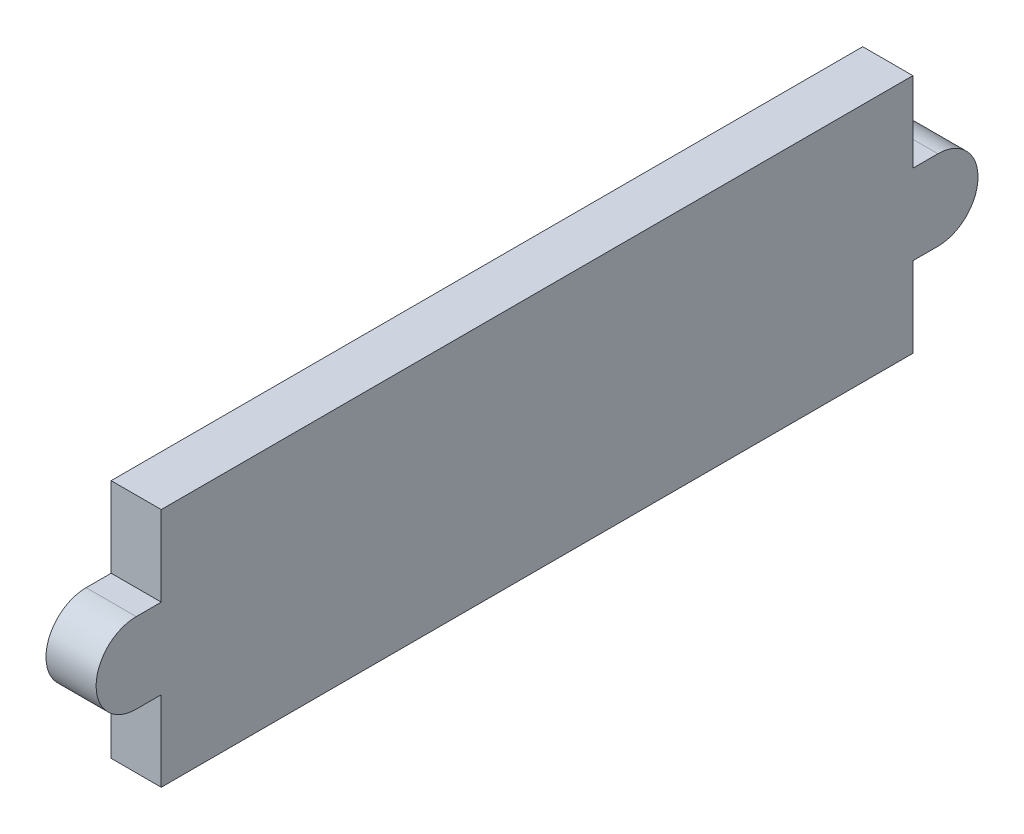
ISO-10303-21;
HEADER;
FILE_DESCRIPTION(('STEP AP214'),'2;1');
FILE_NAME('part.step','',(''),(''),'','','');
FILE_SCHEMA(('AUTOMOTIVE_DESIGN { 1 0 10303 214 1 1 1 1 }'));
ENDSEC;
DATA;
#1=APPLICATION_CONTEXT('core data for automotive mechanical design processes');
#2=APPLICATION_PROTOCOL_DEFINITION('international standard','automotive_design',2000,#1);
#3=PRODUCT_CONTEXT('',#1,'mechanical');
#4=PRODUCT('Part','Part','',(#3));
#5=PRODUCT_RELATED_PRODUCT_CATEGORY('part','',(#4));
#6=PRODUCT_DEFINITION_FORMATION('','',#4);
#7=PRODUCT_DEFINITION_CONTEXT('part definition',#1,'design');
#8=PRODUCT_DEFINITION('design','',#6,#7);
#9=PRODUCT_DEFINITION_SHAPE('','',#8);
#10=(LENGTH_UNIT() NAMED_UNIT(*) SI_UNIT(.MILLI.,.METRE.));
#11=(NAMED_UNIT(*) PLANE_ANGLE_UNIT() SI_UNIT($,.RADIAN.));
#12=(NAMED_UNIT(*) SI_UNIT($,.STERADIAN.) SOLID_ANGLE_UNIT());
#13=UNCERTAINTY_MEASURE_WITH_UNIT(LENGTH_MEASURE(1.E-05),#10,'distance_accuracy_value','');
#14=(GEOMETRIC_REPRESENTATION_CONTEXT(3) GLOBAL_UNCERTAINTY_ASSIGNED_CONTEXT((#13)) GLOBAL_UNIT_ASSIGNED_CONTEXT((#10,
#11,#12)) REPRESENTATION_CONTEXT('',''));
#15=CARTESIAN_POINT('',(0.,0.,0.));
#16=DIRECTION('',(0.,0.,1.));
#17=DIRECTION('',(1.,0.,0.));
#18=AXIS2_PLACEMENT_3D('',#15,#16,#17);
#19=CARTESIAN_POINT('',(-393.5,23.5,550.));
#20=DIRECTION('',(0.,1.,0.));
#21=DIRECTION('',(0.,0.,1.));
#22=AXIS2_PLACEMENT_3D('',#19,#20,#21);
#23=PLANE('',#22);
#24=DIRECTION('',(0.,0.,-1.));
#25=VECTOR('',#24,1.);
#26=CARTESIAN_POINT('',(-398.5,23.5,550.));
#27=LINE('',#26,#25);
#28=CARTESIAN_POINT('',(-398.5,23.5,550.));
#29=VERTEX_POINT('',#28);
#30=CARTESIAN_POINT('',(-398.5,23.5,475.));
#31=VERTEX_POINT('',#30);
#32=EDGE_CURVE('E135',#29,#31,#27,.T.);
#33=ORIENTED_EDGE('',*,*,#32,.T.);
#34=DIRECTION('',(-1.,0.,0.));
#35=VECTOR('',#34,1.);
#36=CARTESIAN_POINT('',(-393.5,23.5,475.));
#37=LINE('',#36,#35);
#38=CARTESIAN_POINT('',(-393.5,23.5,475.));
#39=VERTEX_POINT('',#38);
#40=EDGE_CURVE('E10',#39,#31,#37,.T.);
#41=ORIENTED_EDGE('',*,*,#40,.F.);
#42=DIRECTION('',(0.,0.,-1.));
#43=VECTOR('',#42,1.);
#44=CARTESIAN_POINT('',(-393.5,23.5,550.));
#45=LINE('',#44,#43);
#46=CARTESIAN_POINT('',(-393.5,23.5,550.));
#47=VERTEX_POINT('',#46);
#48=EDGE_CURVE('E157',#47,#39,#45,.T.);
#49=ORIENTED_EDGE('',*,*,#48,.F.);
#50=DIRECTION('',(-1.,0.,0.));
#51=VECTOR('',#50,1.);
#52=CARTESIAN_POINT('',(-393.5,23.5,550.));
#53=LINE('',#52,#51);
#54=EDGE_CURVE('E131',#47,#29,#53,.T.);
#55=ORIENTED_EDGE('',*,*,#54,.T.);
#56=EDGE_LOOP('',(#33,#41,#49,#55));
#57=FACE_BOUND('',#56,.T.);
#58=ADVANCED_FACE('F15',(#57),#23,.F.);
#59=CARTESIAN_POINT('',(-393.5,23.5,475.));
#60=DIRECTION('',(0.,0.,1.));
#61=DIRECTION('',(1.,0.,0.));
#62=AXIS2_PLACEMENT_3D('',#59,#60,#61);
#63=PLANE('',#62);
#64=DIRECTION('',(0.,1.,0.));
#65=VECTOR('',#64,1.);
#66=CARTESIAN_POINT('',(-398.5,23.5,475.));
#67=LINE('',#66,#65);
#68=CARTESIAN_POINT('',(-398.5,31.5,475.));
#69=VERTEX_POINT('',#68);
#70=EDGE_CURVE('E138',#31,#69,#67,.T.);
#71=ORIENTED_EDGE('',*,*,#70,.T.);
#72=DIRECTION('',(-1.,0.,0.));
#73=VECTOR('',#72,1.);
#74=CARTESIAN_POINT('',(-393.5,31.5,475.));
#75=LINE('',#74,#73);
#76=CARTESIAN_POINT('',(-393.5,31.5,475.));
#77=VERTEX_POINT('',#76);
#78=EDGE_CURVE('E23',#77,#69,#75,.T.);
#79=ORIENTED_EDGE('',*,*,#78,.F.);
#80=DIRECTION('',(0.,1.,0.));
#81=VECTOR('',#80,1.);
#82=CARTESIAN_POINT('',(-393.5,23.5,475.));
#83=LINE('',#82,#81);
#84=EDGE_CURVE('E86',#39,#77,#83,.T.);
#85=ORIENTED_EDGE('',*,*,#84,.F.);
#86=ORIENTED_EDGE('',*,*,#40,.T.);
#87=EDGE_LOOP('',(#71,#79,#85,#86));
#88=FACE_BOUND('',#87,.T.);
#89=ADVANCED_FACE('F236',(#88),#63,.F.);
#90=CARTESIAN_POINT('',(-393.5,31.5,475.));
#91=DIRECTION('',(0.,1.,0.));
#92=DIRECTION('',(0.,0.,1.));
#93=AXIS2_PLACEMENT_3D('',#90,#91,#92);
#94=PLANE('',#93);
#95=DIRECTION('',(0.,0.,-1.));
#96=VECTOR('',#95,1.);
#97=CARTESIAN_POINT('',(-398.5,31.5,475.));
#98=LINE('',#97,#96);
#99=CARTESIAN_POINT('',(-398.5,31.5,472.5));
#100=VERTEX_POINT('',#99);
#101=EDGE_CURVE('E140',#69,#100,#98,.T.);
#102=ORIENTED_EDGE('',*,*,#101,.T.);
#103=DIRECTION('',(-1.,0.,0.));
#104=VECTOR('',#103,1.);
#105=CARTESIAN_POINT('',(-393.5,31.5,472.5));
#106=LINE('',#105,#104);
#107=CARTESIAN_POINT('',(-393.5,31.5,472.5));
#108=VERTEX_POINT('',#107);
#109=EDGE_CURVE('E176',#108,#100,#106,.T.);
#110=ORIENTED_EDGE('',*,*,#109,.F.);
#111=DIRECTION('',(0.,0.,-1.));
#112=VECTOR('',#111,1.);
#113=CARTESIAN_POINT('',(-393.5,31.5,475.));
#114=LINE('',#113,#112);
#115=EDGE_CURVE('E184',#77,#108,#114,.T.);
#116=ORIENTED_EDGE('',*,*,#115,.F.);
#117=ORIENTED_EDGE('',*,*,#78,.T.);
#118=EDGE_LOOP('',(#102,#110,#116,#117));
#119=FACE_BOUND('',#118,.T.);
#120=ADVANCED_FACE('F182',(#119),#94,.F.);
#121=CARTESIAN_POINT('',(-393.5,35.5,472.5));
#122=DIRECTION('',(-1.,0.,0.));
#123=DIRECTION('',(0.,0.,1.));
#124=AXIS2_PLACEMENT_3D('',#121,#122,#123);
#125=CYLINDRICAL_SURFACE('',#124,4.);
#126=CARTESIAN_POINT('',(-398.5,35.5,472.5));
#127=DIRECTION('',(1.,0.,0.));
#128=DIRECTION('',(0.,0.,-1.));
#129=AXIS2_PLACEMENT_3D('',#126,#127,#128);
#130=CIRCLE('',#129,4.);
#131=CARTESIAN_POINT('',(-398.5,39.5,472.5));
#132=VERTEX_POINT('',#131);
#133=EDGE_CURVE('E142',#100,#132,#130,.T.);
#134=ORIENTED_EDGE('',*,*,#133,.T.);
#135=DIRECTION('',(-1.,0.,0.));
#136=VECTOR('',#135,1.);
#137=CARTESIAN_POINT('',(-393.5,39.5,472.5));
#138=LINE('',#137,#136);
#139=CARTESIAN_POINT('',(-393.5,39.5,472.5));
#140=VERTEX_POINT('',#139);
#141=EDGE_CURVE('E173',#140,#132,#138,.T.);
#142=ORIENTED_EDGE('',*,*,#141,.F.);
#143=CARTESIAN_POINT('',(-393.5,35.5,472.5));
#144=DIRECTION('',(1.,0.,0.));
#145=DIRECTION('',(0.,0.,-1.));
#146=AXIS2_PLACEMENT_3D('',#143,#144,#145);
#147=CIRCLE('',#146,4.);
#148=EDGE_CURVE('E202',#108,#140,#147,.T.);
#149=ORIENTED_EDGE('',*,*,#148,.F.);
#150=ORIENTED_EDGE('',*,*,#109,.T.);
#151=EDGE_LOOP('',(#134,#142,#149,#150));
#152=FACE_BOUND('',#151,.T.);
#153=ADVANCED_FACE('F193',(#152),#125,.T.);
#154=CARTESIAN_POINT('',(-393.5,39.5,472.5));
#155=DIRECTION('',(0.,-1.,0.));
#156=DIRECTION('',(0.,0.,-1.));
#157=AXIS2_PLACEMENT_3D('',#154,#155,#156);
#158=PLANE('',#157);
#159=DIRECTION('',(0.,0.,1.));
#160=VECTOR('',#159,1.);
#161=CARTESIAN_POINT('',(-398.5,39.5,472.5));
#162=LINE('',#161,#160);
#163=CARTESIAN_POINT('',(-398.5,39.5,475.));
#164=VERTEX_POINT('',#163);
#165=EDGE_CURVE('E144',#132,#164,#162,.T.);
#166=ORIENTED_EDGE('',*,*,#165,.T.);
#167=DIRECTION('',(-1.,0.,0.));
#168=VECTOR('',#167,1.);
#169=CARTESIAN_POINT('',(-393.5,39.5,475.));
#170=LINE('',#169,#168);
#171=CARTESIAN_POINT('',(-393.5,39.5,475.));
#172=VERTEX_POINT('',#171);
#173=EDGE_CURVE('E170',#172,#164,#170,.T.);
#174=ORIENTED_EDGE('',*,*,#173,.F.);
#175=DIRECTION('',(0.,0.,1.));
#176=VECTOR('',#175,1.);
#177=CARTESIAN_POINT('',(-393.5,39.5,472.5));
#178=LINE('',#177,#176);
#179=EDGE_CURVE('E199',#140,#172,#178,.T.);
#180=ORIENTED_EDGE('',*,*,#179,.F.);
#181=ORIENTED_EDGE('',*,*,#141,.T.);
#182=EDGE_LOOP('',(#166,#174,#180,#181));
#183=FACE_BOUND('',#182,.T.);
#184=ADVANCED_FACE('F197',(#183),#158,.F.);
#185=CARTESIAN_POINT('',(-393.5,39.5,475.));
#186=DIRECTION('',(0.,0.,1.));
#187=DIRECTION('',(1.,0.,0.));
#188=AXIS2_PLACEMENT_3D('',#185,#186,#187);
#189=PLANE('',#188);
#190=DIRECTION('',(0.,1.,0.));
#191=VECTOR('',#190,1.);
#192=CARTESIAN_POINT('',(-398.5,39.5,475.));
#193=LINE('',#192,#191);
#194=CARTESIAN_POINT('',(-398.5,47.5,475.));
#195=VERTEX_POINT('',#194);
#196=EDGE_CURVE('E146',#164,#195,#193,.T.);
#197=ORIENTED_EDGE('',*,*,#196,.T.);
#198=DIRECTION('',(-1.,0.,0.));
#199=VECTOR('',#198,1.);
#200=CARTESIAN_POINT('',(-393.5,47.5,475.));
#201=LINE('',#200,#199);
#202=CARTESIAN_POINT('',(-393.5,47.5,475.));
#203=VERTEX_POINT('',#202);
#204=EDGE_CURVE('E167',#203,#195,#201,.T.);
#205=ORIENTED_EDGE('',*,*,#204,.F.);
#206=DIRECTION('',(0.,1.,0.));
#207=VECTOR('',#206,1.);
#208=CARTESIAN_POINT('',(-393.5,39.5,475.));
#209=LINE('',#208,#207);
#210=EDGE_CURVE('E201',#172,#203,#209,.T.);
#211=ORIENTED_EDGE('',*,*,#210,.F.);
#212=ORIENTED_EDGE('',*,*,#173,.T.);
#213=EDGE_LOOP('',(#197,#205,#211,#212));
#214=FACE_BOUND('',#213,.T.);
#215=ADVANCED_FACE('F249',(#214),#189,.F.);
#216=CARTESIAN_POINT('',(-393.5,47.5,475.));
#217=DIRECTION('',(0.,-1.,0.));
#218=DIRECTION('',(0.,0.,-1.));
#219=AXIS2_PLACEMENT_3D('',#216,#217,#218);
#220=PLANE('',#219);
#221=DIRECTION('',(0.,0.,1.));
#222=VECTOR('',#221,1.);
#223=CARTESIAN_POINT('',(-398.5,47.5,475.));
#224=LINE('',#223,#222);
#225=CARTESIAN_POINT('',(-398.5,47.5,550.));
#226=VERTEX_POINT('',#225);
#227=EDGE_CURVE('E148',#195,#226,#224,.T.);
#228=ORIENTED_EDGE('',*,*,#227,.T.);
#229=DIRECTION('',(-1.,0.,0.));
#230=VECTOR('',#229,1.);
#231=CARTESIAN_POINT('',(-393.5,47.5,550.));
#232=LINE('',#231,#230);
#233=CARTESIAN_POINT('',(-393.5,47.5,550.));
#234=VERTEX_POINT('',#233);
#235=EDGE_CURVE('E164',#234,#226,#232,.T.);
#236=ORIENTED_EDGE('',*,*,#235,.F.);
#237=DIRECTION('',(0.,0.,1.));
#238=VECTOR('',#237,1.);
#239=CARTESIAN_POINT('',(-393.5,47.5,475.));
#240=LINE('',#239,#238);
#241=EDGE_CURVE('E204',#203,#234,#240,.T.);
#242=ORIENTED_EDGE('',*,*,#241,.F.);
#243=ORIENTED_EDGE('',*,*,#204,.T.);
#244=EDGE_LOOP('',(#228,#236,#242,#243));
#245=FACE_BOUND('',#244,.T.);
#246=ADVANCED_FACE('F252',(#245),#220,.F.);
#247=CARTESIAN_POINT('',(-393.5,47.5,550.));
#248=DIRECTION('',(0.,0.,-1.));
#249=DIRECTION('',(-1.,0.,0.));
#250=AXIS2_PLACEMENT_3D('',#247,#248,#249);
#251=PLANE('',#250);
#252=DIRECTION('',(0.,-1.,0.));
#253=VECTOR('',#252,1.);
#254=CARTESIAN_POINT('',(-398.5,47.5,550.));
#255=LINE('',#254,#253);
#256=CARTESIAN_POINT('',(-398.5,39.5,550.));
#257=VERTEX_POINT('',#256);
#258=EDGE_CURVE('E150',#226,#257,#255,.T.);
#259=ORIENTED_EDGE('',*,*,#258,.T.);
#260=DIRECTION('',(-1.,0.,0.));
#261=VECTOR('',#260,1.);
#262=CARTESIAN_POINT('',(-393.5,39.5,550.));
#263=LINE('',#262,#261);
#264=CARTESIAN_POINT('',(-393.5,39.5,550.));
#265=VERTEX_POINT('',#264);
#266=EDGE_CURVE('E161',#265,#257,#263,.T.);
#267=ORIENTED_EDGE('',*,*,#266,.F.);
#268=DIRECTION('',(0.,-1.,0.));
#269=VECTOR('',#268,1.);
#270=CARTESIAN_POINT('',(-393.5,47.5,550.));
#271=LINE('',#270,#269);
#272=EDGE_CURVE('E210',#234,#265,#271,.T.);
#273=ORIENTED_EDGE('',*,*,#272,.F.);
#274=ORIENTED_EDGE('',*,*,#235,.T.);
#275=EDGE_LOOP('',(#259,#267,#273,#274));
#276=FACE_BOUND('',#275,.T.);
#277=ADVANCED_FACE('F216',(#276),#251,.F.);
#278=CARTESIAN_POINT('',(-393.5,39.5,550.));
#279=DIRECTION('',(0.,-1.,0.));
#280=DIRECTION('',(0.,0.,-1.));
#281=AXIS2_PLACEMENT_3D('',#278,#279,#280);
#282=PLANE('',#281);
#283=DIRECTION('',(0.,0.,1.));
#284=VECTOR('',#283,1.);
#285=CARTESIAN_POINT('',(-398.5,39.5,550.));
#286=LINE('',#285,#284);
#287=CARTESIAN_POINT('',(-398.5,39.5,552.5));
#288=VERTEX_POINT('',#287);
#289=EDGE_CURVE('E152',#257,#288,#286,.T.);
#290=ORIENTED_EDGE('',*,*,#289,.T.);
#291=DIRECTION('',(-1.,0.,0.));
#292=VECTOR('',#291,1.);
#293=CARTESIAN_POINT('',(-393.5,39.5,552.5));
#294=LINE('',#293,#292);
#295=CARTESIAN_POINT('',(-393.5,39.5,552.5));
#296=VERTEX_POINT('',#295);
#297=EDGE_CURVE('E126',#296,#288,#294,.T.);
#298=ORIENTED_EDGE('',*,*,#297,.F.);
#299=DIRECTION('',(0.,0.,1.));
#300=VECTOR('',#299,1.);
#301=CARTESIAN_POINT('',(-393.5,39.5,550.));
#302=LINE('',#301,#300);
#303=EDGE_CURVE('E117',#265,#296,#302,.T.);
#304=ORIENTED_EDGE('',*,*,#303,.F.);
#305=ORIENTED_EDGE('',*,*,#266,.T.);
#306=EDGE_LOOP('',(#290,#298,#304,#305));
#307=FACE_BOUND('',#306,.T.);
#308=ADVANCED_FACE('F220',(#307),#282,.F.);
#309=CARTESIAN_POINT('',(-393.5,35.5,552.5));
#310=DIRECTION('',(-1.,0.,0.));
#311=DIRECTION('',(0.,0.,1.));
#312=AXIS2_PLACEMENT_3D('',#309,#310,#311);
#313=CYLINDRICAL_SURFACE('',#312,3.99999999999999);
#314=CARTESIAN_POINT('',(-398.5,35.5,552.5));
#315=DIRECTION('',(1.,0.,0.));
#316=DIRECTION('',(0.,0.,-1.));
#317=AXIS2_PLACEMENT_3D('',#314,#315,#316);
#318=CIRCLE('',#317,3.99999999999999);
#319=CARTESIAN_POINT('',(-398.5,31.5,552.5));
#320=VERTEX_POINT('',#319);
#321=EDGE_CURVE('E125',#288,#320,#318,.T.);
#322=ORIENTED_EDGE('',*,*,#321,.T.);
#323=DIRECTION('',(-1.,0.,0.));
#324=VECTOR('',#323,1.);
#325=CARTESIAN_POINT('',(-393.5,31.5,552.5));
#326=LINE('',#325,#324);
#327=CARTESIAN_POINT('',(-393.5,31.5,552.5));
#328=VERTEX_POINT('',#327);
#329=EDGE_CURVE('E122',#328,#320,#326,.T.);
#330=ORIENTED_EDGE('',*,*,#329,.F.);
#331=CARTESIAN_POINT('',(-393.5,35.5,552.5));
#332=DIRECTION('',(1.,0.,0.));
#333=DIRECTION('',(0.,0.,-1.));
#334=AXIS2_PLACEMENT_3D('',#331,#332,#333);
#335=CIRCLE('',#334,3.99999999999999);
#336=EDGE_CURVE('E111',#296,#328,#335,.T.);
#337=ORIENTED_EDGE('',*,*,#336,.F.);
#338=ORIENTED_EDGE('',*,*,#297,.T.);
#339=EDGE_LOOP('',(#322,#330,#337,#338));
#340=FACE_BOUND('',#339,.T.);
#341=ADVANCED_FACE('F123',(#340),#313,.T.);
#342=CARTESIAN_POINT('',(-393.5,31.5,552.5));
#343=DIRECTION('',(0.,1.,0.));
#344=DIRECTION('',(0.,0.,1.));
#345=AXIS2_PLACEMENT_3D('',#342,#343,#344);
#346=PLANE('',#345);
#347=DIRECTION('',(0.,0.,-1.));
#348=VECTOR('',#347,1.);
#349=CARTESIAN_POINT('',(-398.5,31.5,552.5));
#350=LINE('',#349,#348);
#351=CARTESIAN_POINT('',(-398.5,31.5,550.));
#352=VERTEX_POINT('',#351);
#353=EDGE_CURVE('E72',#320,#352,#350,.T.);
#354=ORIENTED_EDGE('',*,*,#353,.T.);
#355=DIRECTION('',(-1.,0.,0.));
#356=VECTOR('',#355,1.);
#357=CARTESIAN_POINT('',(-393.5,31.5,550.));
#358=LINE('',#357,#356);
#359=CARTESIAN_POINT('',(-393.5,31.5,550.));
#360=VERTEX_POINT('',#359);
#361=EDGE_CURVE('E127',#360,#352,#358,.T.);
#362=ORIENTED_EDGE('',*,*,#361,.F.);
#363=DIRECTION('',(0.,0.,-1.));
#364=VECTOR('',#363,1.);
#365=CARTESIAN_POINT('',(-393.5,31.5,552.5));
#366=LINE('',#365,#364);
#367=EDGE_CURVE('E115',#328,#360,#366,.T.);
#368=ORIENTED_EDGE('',*,*,#367,.F.);
#369=ORIENTED_EDGE('',*,*,#329,.T.);
#370=EDGE_LOOP('',(#354,#362,#368,#369));
#371=FACE_BOUND('',#370,.T.);
#372=ADVANCED_FACE('F129',(#371),#346,.F.);
#373=CARTESIAN_POINT('',(-393.5,31.5,550.));
#374=DIRECTION('',(0.,0.,-1.));
#375=DIRECTION('',(-1.,0.,0.));
#376=AXIS2_PLACEMENT_3D('',#373,#374,#375);
#377=PLANE('',#376);
#378=DIRECTION('',(0.,-1.,0.));
#379=VECTOR('',#378,1.);
#380=CARTESIAN_POINT('',(-398.5,31.5,550.));
#381=LINE('',#380,#379);
#382=EDGE_CURVE('E78',#352,#29,#381,.T.);
#383=ORIENTED_EDGE('',*,*,#382,.T.);
#384=ORIENTED_EDGE('',*,*,#54,.F.);
#385=DIRECTION('',(0.,-1.,0.));
#386=VECTOR('',#385,1.);
#387=CARTESIAN_POINT('',(-393.5,31.5,550.));
#388=LINE('',#387,#386);
#389=EDGE_CURVE('E31',#360,#47,#388,.T.);
#390=ORIENTED_EDGE('',*,*,#389,.F.);
#391=ORIENTED_EDGE('',*,*,#361,.T.);
#392=EDGE_LOOP('',(#383,#384,#390,#391));
#393=FACE_BOUND('',#392,.T.);
#394=ADVANCED_FACE('F224',(#393),#377,.F.);
#395=CARTESIAN_POINT('',(-393.5,35.5,472.5));
#396=DIRECTION('',(1.,0.,0.));
#397=DIRECTION('',(0.,0.,-1.));
#398=AXIS2_PLACEMENT_3D('',#395,#396,#397);
#399=PLANE('',#398);
#400=ORIENTED_EDGE('',*,*,#48,.T.);
#401=ORIENTED_EDGE('',*,*,#84,.T.);
#402=ORIENTED_EDGE('',*,*,#115,.T.);
#403=ORIENTED_EDGE('',*,*,#148,.T.);
#404=ORIENTED_EDGE('',*,*,#179,.T.);
#405=ORIENTED_EDGE('',*,*,#210,.T.);
#406=ORIENTED_EDGE('',*,*,#241,.T.);
#407=ORIENTED_EDGE('',*,*,#272,.T.);
#408=ORIENTED_EDGE('',*,*,#303,.T.);
#409=ORIENTED_EDGE('',*,*,#336,.T.);
#410=ORIENTED_EDGE('',*,*,#367,.T.);
#411=ORIENTED_EDGE('',*,*,#389,.T.);
#412=EDGE_LOOP('',(#400,#401,#402,#403,#404,#405,#406,#407,#408,#409,#410,#411));
#413=FACE_BOUND('',#412,.T.);
#414=ADVANCED_FACE('F113',(#413),#399,.T.);
#415=CARTESIAN_POINT('',(-398.5,35.5,472.5));
#416=DIRECTION('',(1.,0.,0.));
#417=DIRECTION('',(0.,0.,-1.));
#418=AXIS2_PLACEMENT_3D('',#415,#416,#417);
#419=PLANE('',#418);
#420=ORIENTED_EDGE('',*,*,#32,.F.);
#421=ORIENTED_EDGE('',*,*,#382,.F.);
#422=ORIENTED_EDGE('',*,*,#353,.F.);
#423=ORIENTED_EDGE('',*,*,#321,.F.);
#424=ORIENTED_EDGE('',*,*,#289,.F.);
#425=ORIENTED_EDGE('',*,*,#258,.F.);
#426=ORIENTED_EDGE('',*,*,#227,.F.);
#427=ORIENTED_EDGE('',*,*,#196,.F.);
#428=ORIENTED_EDGE('',*,*,#165,.F.);
#429=ORIENTED_EDGE('',*,*,#133,.F.);
#430=ORIENTED_EDGE('',*,*,#101,.F.);
#431=ORIENTED_EDGE('',*,*,#70,.F.);
#432=EDGE_LOOP('',(#420,#421,#422,#423,#424,#425,#426,#427,#428,#429,#430,#431));
#433=FACE_BOUND('',#432,.T.);
#434=ADVANCED_FACE('F188',(#433),#419,.F.);
#435=CLOSED_SHELL('',(#58,#89,#120,#153,#184,#215,#246,#277,#308,#341,#372,#394,#414,#434));
#436=MANIFOLD_SOLID_BREP('B1',#435);
#437=ADVANCED_BREP_SHAPE_REPRESENTATION('',(#18,#436),#14);
#438=SHAPE_DEFINITION_REPRESENTATION(#9,#437);
ENDSEC;
END-ISO-10303-21;
